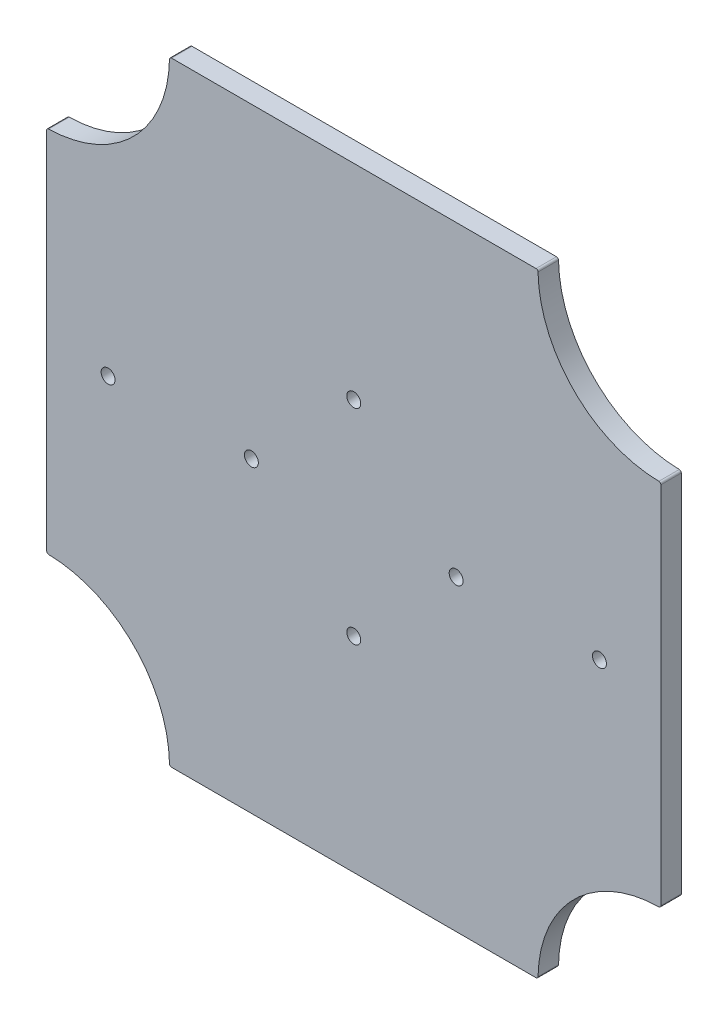
ISO-10303-21;
HEADER;
FILE_DESCRIPTION(('STEP AP214'),'2;1');
FILE_NAME('part.step','',(''),(''),'','','');
FILE_SCHEMA(('AUTOMOTIVE_DESIGN { 1 0 10303 214 1 1 1 1 }'));
ENDSEC;
DATA;
#1=APPLICATION_CONTEXT('core data for automotive mechanical design processes');
#2=APPLICATION_PROTOCOL_DEFINITION('international standard','automotive_design',2000,#1);
#3=PRODUCT_CONTEXT('',#1,'mechanical');
#4=PRODUCT('Part','Part','',(#3));
#5=PRODUCT_RELATED_PRODUCT_CATEGORY('part','',(#4));
#6=PRODUCT_DEFINITION_FORMATION('','',#4);
#7=PRODUCT_DEFINITION_CONTEXT('part definition',#1,'design');
#8=PRODUCT_DEFINITION('design','',#6,#7);
#9=PRODUCT_DEFINITION_SHAPE('','',#8);
#10=(LENGTH_UNIT() NAMED_UNIT(*) SI_UNIT(.MILLI.,.METRE.));
#11=(NAMED_UNIT(*) PLANE_ANGLE_UNIT() SI_UNIT($,.RADIAN.));
#12=(NAMED_UNIT(*) SI_UNIT($,.STERADIAN.) SOLID_ANGLE_UNIT());
#13=UNCERTAINTY_MEASURE_WITH_UNIT(LENGTH_MEASURE(1.E-05),#10,'distance_accuracy_value','');
#14=(GEOMETRIC_REPRESENTATION_CONTEXT(3) GLOBAL_UNCERTAINTY_ASSIGNED_CONTEXT((#13)) GLOBAL_UNIT_ASSIGNED_CONTEXT((#10,
#11,#12)) REPRESENTATION_CONTEXT('',''));
#15=CARTESIAN_POINT('',(0.,0.,0.));
#16=DIRECTION('',(0.,0.,1.));
#17=DIRECTION('',(1.,0.,0.));
#18=AXIS2_PLACEMENT_3D('',#15,#16,#17);
#19=CARTESIAN_POINT('',(0.,0.,0.));
#20=DIRECTION('',(0.,0.,1.));
#21=DIRECTION('',(1.,0.,0.));
#22=AXIS2_PLACEMENT_3D('',#19,#20,#21);
#23=PLANE('',#22);
#24=CARTESIAN_POINT('',(0.,-25.,0.));
#25=DIRECTION('',(0.,0.,-1.));
#26=DIRECTION('',(-1.,0.,0.));
#27=AXIS2_PLACEMENT_3D('',#24,#25,#26);
#28=CIRCLE('',#27,1.69999999999999);
#29=CARTESIAN_POINT('',(-1.69999999999999,-25.,0.));
#30=VERTEX_POINT('',#29);
#31=EDGE_CURVE('E522',#30,#30,#28,.T.);
#32=ORIENTED_EDGE('',*,*,#31,.F.);
#33=EDGE_LOOP('',(#32));
#34=FACE_BOUND('',#33,.T.);
#35=CARTESIAN_POINT('',(-59.9999999999987,0.,0.));
#36=DIRECTION('',(0.,0.,-1.));
#37=DIRECTION('',(-1.,0.,0.));
#38=AXIS2_PLACEMENT_3D('',#35,#36,#37);
#39=CIRCLE('',#38,1.69999999999999);
#40=CARTESIAN_POINT('',(-61.6999999999986,0.,0.));
#41=VERTEX_POINT('',#40);
#42=EDGE_CURVE('E516',#41,#41,#39,.T.);
#43=ORIENTED_EDGE('',*,*,#42,.F.);
#44=EDGE_LOOP('',(#43));
#45=FACE_BOUND('',#44,.T.);
#46=CARTESIAN_POINT('',(75.,75.,0.));
#47=DIRECTION('',(0.,0.,1.));
#48=DIRECTION('',(1.,0.,0.));
#49=AXIS2_PLACEMENT_3D('',#46,#47,#48);
#50=CIRCLE('',#49,30.);
#51=CARTESIAN_POINT('',(74.5081967213114,45.0040314452913,0.));
#52=VERTEX_POINT('',#51);
#53=CARTESIAN_POINT('',(45.0040314452913,74.5081967213115,0.));
#54=VERTEX_POINT('',#53);
#55=EDGE_CURVE('E271',#52,#54,#50,.F.);
#56=ORIENTED_EDGE('',*,*,#55,.F.);
#57=CARTESIAN_POINT('',(74.5,44.5040986360462,0.));
#58=DIRECTION('',(0.,0.,1.));
#59=DIRECTION('',(1.,0.,0.));
#60=AXIS2_PLACEMENT_3D('',#57,#58,#59);
#61=CIRCLE('',#60,0.5);
#62=CARTESIAN_POINT('',(75.,44.5040986360462,0.));
#63=VERTEX_POINT('',#62);
#64=EDGE_CURVE('E216',#52,#63,#61,.F.);
#65=ORIENTED_EDGE('',*,*,#64,.T.);
#66=DIRECTION('',(0.,1.,0.));
#67=VECTOR('',#66,1.);
#68=CARTESIAN_POINT('',(75.,75.,0.));
#69=LINE('',#68,#67);
#70=CARTESIAN_POINT('',(75.,-44.5040986360448,0.));
#71=VERTEX_POINT('',#70);
#72=EDGE_CURVE('E272',#71,#63,#69,.T.);
#73=ORIENTED_EDGE('',*,*,#72,.F.);
#74=CARTESIAN_POINT('',(74.5,-44.5040986360448,0.));
#75=DIRECTION('',(0.,0.,1.));
#76=DIRECTION('',(1.,0.,0.));
#77=AXIS2_PLACEMENT_3D('',#74,#75,#76);
#78=CIRCLE('',#77,0.5);
#79=CARTESIAN_POINT('',(74.5081967213115,-45.00403144529,0.));
#80=VERTEX_POINT('',#79);
#81=EDGE_CURVE('E178',#71,#80,#78,.F.);
#82=ORIENTED_EDGE('',*,*,#81,.T.);
#83=CARTESIAN_POINT('',(75.0000000000028,-74.9999999999986,0.));
#84=DIRECTION('',(0.,0.,1.));
#85=DIRECTION('',(1.,0.,0.));
#86=AXIS2_PLACEMENT_3D('',#83,#84,#85);
#87=CIRCLE('',#86,30.);
#88=CARTESIAN_POINT('',(45.0040314452941,-74.5081967213114,0.));
#89=VERTEX_POINT('',#88);
#90=EDGE_CURVE('E246',#89,#80,#87,.F.);
#91=ORIENTED_EDGE('',*,*,#90,.F.);
#92=CARTESIAN_POINT('',(44.504098636049,-74.5,0.));
#93=DIRECTION('',(0.,0.,1.));
#94=DIRECTION('',(1.,0.,0.));
#95=AXIS2_PLACEMENT_3D('',#92,#93,#94);
#96=CIRCLE('',#95,0.5);
#97=CARTESIAN_POINT('',(44.504098636049,-75.,0.));
#98=VERTEX_POINT('',#97);
#99=EDGE_CURVE('E204',#89,#98,#96,.F.);
#100=ORIENTED_EDGE('',*,*,#99,.T.);
#101=DIRECTION('',(1.,0.,0.));
#102=VECTOR('',#101,1.);
#103=CARTESIAN_POINT('',(-75.,-75.,0.));
#104=LINE('',#103,#102);
#105=CARTESIAN_POINT('',(-44.504098636042,-75.,0.));
#106=VERTEX_POINT('',#105);
#107=EDGE_CURVE('E260',#106,#98,#104,.T.);
#108=ORIENTED_EDGE('',*,*,#107,.F.);
#109=CARTESIAN_POINT('',(-44.504098636042,-74.5,0.));
#110=DIRECTION('',(0.,0.,1.));
#111=DIRECTION('',(1.,0.,0.));
#112=AXIS2_PLACEMENT_3D('',#109,#110,#111);
#113=CIRCLE('',#112,0.5);
#114=CARTESIAN_POINT('',(-45.0040314452871,-74.5081967213115,0.));
#115=VERTEX_POINT('',#114);
#116=EDGE_CURVE('E53',#106,#115,#113,.F.);
#117=ORIENTED_EDGE('',*,*,#116,.T.);
#118=CARTESIAN_POINT('',(-74.9999999999958,-75.0000000000014,0.));
#119=DIRECTION('',(0.,0.,1.));
#120=DIRECTION('',(1.,0.,0.));
#121=AXIS2_PLACEMENT_3D('',#118,#119,#120);
#122=CIRCLE('',#121,30.);
#123=CARTESIAN_POINT('',(-74.5081967213114,-45.0040314452927,0.));
#124=VERTEX_POINT('',#123);
#125=EDGE_CURVE('E302',#124,#115,#122,.F.);
#126=ORIENTED_EDGE('',*,*,#125,.F.);
#127=CARTESIAN_POINT('',(-74.5,-44.5040986360476,0.));
#128=DIRECTION('',(0.,0.,1.));
#129=DIRECTION('',(1.,0.,0.));
#130=AXIS2_PLACEMENT_3D('',#127,#128,#129);
#131=CIRCLE('',#130,0.5);
#132=CARTESIAN_POINT('',(-75.,-44.5040986360476,0.));
#133=VERTEX_POINT('',#132);
#134=EDGE_CURVE('E208',#124,#133,#131,.F.);
#135=ORIENTED_EDGE('',*,*,#134,.T.);
#136=DIRECTION('',(0.,-1.,0.));
#137=VECTOR('',#136,1.);
#138=CARTESIAN_POINT('',(-75.,75.,0.));
#139=LINE('',#138,#137);
#140=CARTESIAN_POINT('',(-75.,44.5040986360433,0.));
#141=VERTEX_POINT('',#140);
#142=EDGE_CURVE('E268',#141,#133,#139,.T.);
#143=ORIENTED_EDGE('',*,*,#142,.F.);
#144=CARTESIAN_POINT('',(-74.5,44.5040986360433,0.));
#145=DIRECTION('',(0.,0.,1.));
#146=DIRECTION('',(1.,0.,0.));
#147=AXIS2_PLACEMENT_3D('',#144,#145,#146);
#148=CIRCLE('',#147,0.5);
#149=CARTESIAN_POINT('',(-74.5081967213115,45.0040314452885,0.));
#150=VERTEX_POINT('',#149);
#151=EDGE_CURVE('E210',#141,#150,#148,.F.);
#152=ORIENTED_EDGE('',*,*,#151,.T.);
#153=CARTESIAN_POINT('',(-74.9999999999986,74.9999999999972,0.));
#154=DIRECTION('',(0.,0.,1.));
#155=DIRECTION('',(1.,0.,0.));
#156=AXIS2_PLACEMENT_3D('',#153,#154,#155);
#157=CIRCLE('',#156,30.);
#158=CARTESIAN_POINT('',(-45.0040314452899,74.5081967213114,0.));
#159=VERTEX_POINT('',#158);
#160=EDGE_CURVE('E293',#159,#150,#157,.F.);
#161=ORIENTED_EDGE('',*,*,#160,.F.);
#162=CARTESIAN_POINT('',(-44.5040986360448,74.5,0.));
#163=DIRECTION('',(0.,0.,1.));
#164=DIRECTION('',(1.,0.,0.));
#165=AXIS2_PLACEMENT_3D('',#162,#163,#164);
#166=CIRCLE('',#165,0.5);
#167=CARTESIAN_POINT('',(-44.5040986360448,75.,0.));
#168=VERTEX_POINT('',#167);
#169=EDGE_CURVE('E212',#159,#168,#166,.F.);
#170=ORIENTED_EDGE('',*,*,#169,.T.);
#171=DIRECTION('',(-1.,0.,0.));
#172=VECTOR('',#171,1.);
#173=CARTESIAN_POINT('',(-75.,75.,0.));
#174=LINE('',#173,#172);
#175=CARTESIAN_POINT('',(44.5040986360462,75.,0.));
#176=VERTEX_POINT('',#175);
#177=EDGE_CURVE('E184',#176,#168,#174,.T.);
#178=ORIENTED_EDGE('',*,*,#177,.F.);
#179=CARTESIAN_POINT('',(44.5040986360462,74.5,0.));
#180=DIRECTION('',(0.,0.,1.));
#181=DIRECTION('',(1.,0.,0.));
#182=AXIS2_PLACEMENT_3D('',#179,#180,#181);
#183=CIRCLE('',#182,0.5);
#184=EDGE_CURVE('E214',#176,#54,#183,.F.);
#185=ORIENTED_EDGE('',*,*,#184,.T.);
#186=EDGE_LOOP('',(#56,#65,#73,#82,#91,#100,#108,#117,#126,#135,#143,#152,#161,#170,#178,#185));
#187=FACE_BOUND('',#186,.T.);
#188=CARTESIAN_POINT('',(60.0000000000028,0.,0.));
#189=DIRECTION('',(0.,0.,-1.));
#190=DIRECTION('',(-1.,0.,0.));
#191=AXIS2_PLACEMENT_3D('',#188,#189,#190);
#192=CIRCLE('',#191,1.69999999999999);
#193=CARTESIAN_POINT('',(58.3000000000028,0.,0.));
#194=VERTEX_POINT('',#193);
#195=EDGE_CURVE('E299',#194,#194,#192,.T.);
#196=ORIENTED_EDGE('',*,*,#195,.F.);
#197=EDGE_LOOP('',(#196));
#198=FACE_BOUND('',#197,.T.);
#199=CARTESIAN_POINT('',(25.,0.,0.));
#200=DIRECTION('',(0.,0.,-1.));
#201=DIRECTION('',(-1.,0.,0.));
#202=AXIS2_PLACEMENT_3D('',#199,#200,#201);
#203=CIRCLE('',#202,1.69999999999999);
#204=CARTESIAN_POINT('',(23.3,0.,0.));
#205=VERTEX_POINT('',#204);
#206=EDGE_CURVE('E504',#205,#205,#203,.T.);
#207=ORIENTED_EDGE('',*,*,#206,.F.);
#208=EDGE_LOOP('',(#207));
#209=FACE_BOUND('',#208,.T.);
#210=CARTESIAN_POINT('',(-25.,0.,0.));
#211=DIRECTION('',(0.,0.,-1.));
#212=DIRECTION('',(-1.,0.,0.));
#213=AXIS2_PLACEMENT_3D('',#210,#211,#212);
#214=CIRCLE('',#213,1.69999999999999);
#215=CARTESIAN_POINT('',(-26.7,0.,0.));
#216=VERTEX_POINT('',#215);
#217=EDGE_CURVE('E510',#216,#216,#214,.T.);
#218=ORIENTED_EDGE('',*,*,#217,.F.);
#219=EDGE_LOOP('',(#218));
#220=FACE_BOUND('',#219,.T.);
#221=CARTESIAN_POINT('',(0.,25.,0.));
#222=DIRECTION('',(0.,0.,-1.));
#223=DIRECTION('',(-1.,0.,0.));
#224=AXIS2_PLACEMENT_3D('',#221,#222,#223);
#225=CIRCLE('',#224,1.69999999999999);
#226=CARTESIAN_POINT('',(-1.69999999999999,25.,0.));
#227=VERTEX_POINT('',#226);
#228=EDGE_CURVE('E528',#227,#227,#225,.T.);
#229=ORIENTED_EDGE('',*,*,#228,.F.);
#230=EDGE_LOOP('',(#229));
#231=FACE_BOUND('',#230,.T.);
#232=ADVANCED_FACE('F38',(#34,#45,#187,#198,#209,#220,#231),#23,.F.);
#233=CARTESIAN_POINT('',(-75.,75.,5.));
#234=DIRECTION('',(1.,0.,0.));
#235=DIRECTION('',(0.,1.,0.));
#236=AXIS2_PLACEMENT_3D('',#233,#234,#235);
#237=PLANE('',#236);
#238=DIRECTION('',(0.,-1.,0.));
#239=VECTOR('',#238,1.);
#240=CARTESIAN_POINT('',(-75.,75.,5.));
#241=LINE('',#240,#239);
#242=CARTESIAN_POINT('',(-75.,44.5040986360433,5.));
#243=VERTEX_POINT('',#242);
#244=CARTESIAN_POINT('',(-75.,-44.5040986360476,5.));
#245=VERTEX_POINT('',#244);
#246=EDGE_CURVE('E262',#243,#245,#241,.T.);
#247=ORIENTED_EDGE('',*,*,#246,.F.);
#248=DIRECTION('',(0.,0.,1.));
#249=VECTOR('',#248,1.);
#250=CARTESIAN_POINT('',(-75.,44.5040986360433,5.));
#251=LINE('',#250,#249);
#252=EDGE_CURVE('E231',#243,#141,#251,.F.);
#253=ORIENTED_EDGE('',*,*,#252,.T.);
#254=ORIENTED_EDGE('',*,*,#142,.T.);
#255=DIRECTION('',(0.,0.,1.));
#256=VECTOR('',#255,1.);
#257=CARTESIAN_POINT('',(-75.,-44.5040986360476,5.));
#258=LINE('',#257,#256);
#259=EDGE_CURVE('E228',#133,#245,#258,.T.);
#260=ORIENTED_EDGE('',*,*,#259,.T.);
#261=EDGE_LOOP('',(#247,#253,#254,#260));
#262=FACE_BOUND('',#261,.T.);
#263=ADVANCED_FACE('F328',(#262),#237,.F.);
#264=CARTESIAN_POINT('',(-75.,-75.,5.));
#265=DIRECTION('',(0.,1.,0.));
#266=DIRECTION('',(0.,0.,1.));
#267=AXIS2_PLACEMENT_3D('',#264,#265,#266);
#268=PLANE('',#267);
#269=DIRECTION('',(1.,0.,0.));
#270=VECTOR('',#269,1.);
#271=CARTESIAN_POINT('',(-75.,-75.,5.));
#272=LINE('',#271,#270);
#273=CARTESIAN_POINT('',(-44.504098636042,-75.,5.));
#274=VERTEX_POINT('',#273);
#275=CARTESIAN_POINT('',(44.504098636049,-75.,5.));
#276=VERTEX_POINT('',#275);
#277=EDGE_CURVE('E174',#274,#276,#272,.T.);
#278=ORIENTED_EDGE('',*,*,#277,.F.);
#279=DIRECTION('',(0.,0.,1.));
#280=VECTOR('',#279,1.);
#281=CARTESIAN_POINT('',(-44.504098636042,-75.,5.));
#282=LINE('',#281,#280);
#283=EDGE_CURVE('E240',#274,#106,#282,.F.);
#284=ORIENTED_EDGE('',*,*,#283,.T.);
#285=ORIENTED_EDGE('',*,*,#107,.T.);
#286=DIRECTION('',(0.,0.,1.));
#287=VECTOR('',#286,1.);
#288=CARTESIAN_POINT('',(44.504098636049,-75.,5.));
#289=LINE('',#288,#287);
#290=EDGE_CURVE('E237',#98,#276,#289,.T.);
#291=ORIENTED_EDGE('',*,*,#290,.T.);
#292=EDGE_LOOP('',(#278,#284,#285,#291));
#293=FACE_BOUND('',#292,.T.);
#294=ADVANCED_FACE('F258',(#293),#268,.F.);
#295=CARTESIAN_POINT('',(75.,75.,5.));
#296=DIRECTION('',(-1.,0.,0.));
#297=DIRECTION('',(0.,-1.,0.));
#298=AXIS2_PLACEMENT_3D('',#295,#296,#297);
#299=PLANE('',#298);
#300=ORIENTED_EDGE('',*,*,#72,.T.);
#301=DIRECTION('',(0.,0.,1.));
#302=VECTOR('',#301,1.);
#303=CARTESIAN_POINT('',(75.,44.5040986360462,5.));
#304=LINE('',#303,#302);
#305=CARTESIAN_POINT('',(75.,44.5040986360462,5.));
#306=VERTEX_POINT('',#305);
#307=EDGE_CURVE('E172',#63,#306,#304,.T.);
#308=ORIENTED_EDGE('',*,*,#307,.T.);
#309=DIRECTION('',(0.,1.,0.));
#310=VECTOR('',#309,1.);
#311=CARTESIAN_POINT('',(75.,75.,5.));
#312=LINE('',#311,#310);
#313=CARTESIAN_POINT('',(75.,-44.5040986360448,5.));
#314=VERTEX_POINT('',#313);
#315=EDGE_CURVE('E156',#314,#306,#312,.T.);
#316=ORIENTED_EDGE('',*,*,#315,.F.);
#317=DIRECTION('',(0.,0.,1.));
#318=VECTOR('',#317,1.);
#319=CARTESIAN_POINT('',(75.,-44.5040986360448,5.));
#320=LINE('',#319,#318);
#321=EDGE_CURVE('E169',#314,#71,#320,.F.);
#322=ORIENTED_EDGE('',*,*,#321,.T.);
#323=EDGE_LOOP('',(#300,#308,#316,#322));
#324=FACE_BOUND('',#323,.T.);
#325=ADVANCED_FACE('F168',(#324),#299,.F.);
#326=CARTESIAN_POINT('',(-75.,75.,5.));
#327=DIRECTION('',(0.,-1.,0.));
#328=DIRECTION('',(0.,0.,-1.));
#329=AXIS2_PLACEMENT_3D('',#326,#327,#328);
#330=PLANE('',#329);
#331=DIRECTION('',(-1.,0.,0.));
#332=VECTOR('',#331,1.);
#333=CARTESIAN_POINT('',(-75.,75.,5.));
#334=LINE('',#333,#332);
#335=CARTESIAN_POINT('',(44.5040986360462,75.,5.));
#336=VERTEX_POINT('',#335);
#337=CARTESIAN_POINT('',(-44.5040986360448,75.,5.));
#338=VERTEX_POINT('',#337);
#339=EDGE_CURVE('E173',#336,#338,#334,.T.);
#340=ORIENTED_EDGE('',*,*,#339,.F.);
#341=DIRECTION('',(0.,0.,1.));
#342=VECTOR('',#341,1.);
#343=CARTESIAN_POINT('',(44.5040986360462,75.,5.));
#344=LINE('',#343,#342);
#345=EDGE_CURVE('E221',#336,#176,#344,.F.);
#346=ORIENTED_EDGE('',*,*,#345,.T.);
#347=ORIENTED_EDGE('',*,*,#177,.T.);
#348=DIRECTION('',(0.,0.,1.));
#349=VECTOR('',#348,1.);
#350=CARTESIAN_POINT('',(-44.5040986360448,75.,5.));
#351=LINE('',#350,#349);
#352=EDGE_CURVE('E218',#168,#338,#351,.T.);
#353=ORIENTED_EDGE('',*,*,#352,.T.);
#354=EDGE_LOOP('',(#340,#346,#347,#353));
#355=FACE_BOUND('',#354,.T.);
#356=ADVANCED_FACE('F278',(#355),#330,.F.);
#357=CARTESIAN_POINT('',(0.,0.,5.));
#358=DIRECTION('',(0.,0.,1.));
#359=DIRECTION('',(1.,0.,0.));
#360=AXIS2_PLACEMENT_3D('',#357,#358,#359);
#361=PLANE('',#360);
#362=CARTESIAN_POINT('',(0.,25.,5.));
#363=DIRECTION('',(0.,0.,1.));
#364=DIRECTION('',(1.,0.,0.));
#365=AXIS2_PLACEMENT_3D('',#362,#363,#364);
#366=CIRCLE('',#365,1.69999999999999);
#367=CARTESIAN_POINT('',(1.69999999999999,25.,5.));
#368=VERTEX_POINT('',#367);
#369=EDGE_CURVE('E525',#368,#368,#366,.T.);
#370=ORIENTED_EDGE('',*,*,#369,.F.);
#371=EDGE_LOOP('',(#370));
#372=FACE_BOUND('',#371,.T.);
#373=CARTESIAN_POINT('',(0.,-25.,5.));
#374=DIRECTION('',(0.,0.,1.));
#375=DIRECTION('',(1.,0.,0.));
#376=AXIS2_PLACEMENT_3D('',#373,#374,#375);
#377=CIRCLE('',#376,1.69999999999999);
#378=CARTESIAN_POINT('',(1.69999999999999,-25.,5.));
#379=VERTEX_POINT('',#378);
#380=EDGE_CURVE('E519',#379,#379,#377,.T.);
#381=ORIENTED_EDGE('',*,*,#380,.F.);
#382=EDGE_LOOP('',(#381));
#383=FACE_BOUND('',#382,.T.);
#384=CARTESIAN_POINT('',(-59.9999999999987,0.,5.));
#385=DIRECTION('',(0.,0.,1.));
#386=DIRECTION('',(1.,0.,0.));
#387=AXIS2_PLACEMENT_3D('',#384,#385,#386);
#388=CIRCLE('',#387,1.69999999999999);
#389=CARTESIAN_POINT('',(-58.2999999999987,0.,5.));
#390=VERTEX_POINT('',#389);
#391=EDGE_CURVE('E513',#390,#390,#388,.T.);
#392=ORIENTED_EDGE('',*,*,#391,.F.);
#393=EDGE_LOOP('',(#392));
#394=FACE_BOUND('',#393,.T.);
#395=CARTESIAN_POINT('',(-25.,0.,5.));
#396=DIRECTION('',(0.,0.,1.));
#397=DIRECTION('',(1.,0.,0.));
#398=AXIS2_PLACEMENT_3D('',#395,#396,#397);
#399=CIRCLE('',#398,1.69999999999999);
#400=CARTESIAN_POINT('',(-23.3,0.,5.));
#401=VERTEX_POINT('',#400);
#402=EDGE_CURVE('E507',#401,#401,#399,.T.);
#403=ORIENTED_EDGE('',*,*,#402,.F.);
#404=EDGE_LOOP('',(#403));
#405=FACE_BOUND('',#404,.T.);
#406=CARTESIAN_POINT('',(25.,0.,5.));
#407=DIRECTION('',(0.,0.,1.));
#408=DIRECTION('',(1.,0.,0.));
#409=AXIS2_PLACEMENT_3D('',#406,#407,#408);
#410=CIRCLE('',#409,1.69999999999999);
#411=CARTESIAN_POINT('',(26.7,0.,5.));
#412=VERTEX_POINT('',#411);
#413=EDGE_CURVE('E501',#412,#412,#410,.T.);
#414=ORIENTED_EDGE('',*,*,#413,.F.);
#415=EDGE_LOOP('',(#414));
#416=FACE_BOUND('',#415,.T.);
#417=CARTESIAN_POINT('',(60.0000000000028,0.,5.));
#418=DIRECTION('',(0.,0.,1.));
#419=DIRECTION('',(1.,0.,0.));
#420=AXIS2_PLACEMENT_3D('',#417,#418,#419);
#421=CIRCLE('',#420,1.69999999999999);
#422=CARTESIAN_POINT('',(61.7000000000028,0.,5.));
#423=VERTEX_POINT('',#422);
#424=EDGE_CURVE('E294',#423,#423,#421,.T.);
#425=ORIENTED_EDGE('',*,*,#424,.F.);
#426=EDGE_LOOP('',(#425));
#427=FACE_BOUND('',#426,.T.);
#428=ORIENTED_EDGE('',*,*,#315,.T.);
#429=CARTESIAN_POINT('',(74.5,44.5040986360462,5.));
#430=DIRECTION('',(0.,0.,1.));
#431=DIRECTION('',(1.,0.,0.));
#432=AXIS2_PLACEMENT_3D('',#429,#430,#431);
#433=CIRCLE('',#432,0.5);
#434=CARTESIAN_POINT('',(74.5081967213114,45.0040314452913,5.));
#435=VERTEX_POINT('',#434);
#436=EDGE_CURVE('E197',#306,#435,#433,.T.);
#437=ORIENTED_EDGE('',*,*,#436,.T.);
#438=CARTESIAN_POINT('',(75.,75.,5.));
#439=DIRECTION('',(0.,0.,1.));
#440=DIRECTION('',(1.,0.,0.));
#441=AXIS2_PLACEMENT_3D('',#438,#439,#440);
#442=CIRCLE('',#441,30.);
#443=CARTESIAN_POINT('',(45.0040314452913,74.5081967213115,5.));
#444=VERTEX_POINT('',#443);
#445=EDGE_CURVE('E252',#444,#435,#442,.T.);
#446=ORIENTED_EDGE('',*,*,#445,.F.);
#447=CARTESIAN_POINT('',(44.5040986360462,74.5,5.));
#448=DIRECTION('',(0.,0.,1.));
#449=DIRECTION('',(1.,0.,0.));
#450=AXIS2_PLACEMENT_3D('',#447,#448,#449);
#451=CIRCLE('',#450,0.5);
#452=EDGE_CURVE('E195',#444,#336,#451,.T.);
#453=ORIENTED_EDGE('',*,*,#452,.T.);
#454=ORIENTED_EDGE('',*,*,#339,.T.);
#455=CARTESIAN_POINT('',(-44.5040986360448,74.5,5.));
#456=DIRECTION('',(0.,0.,1.));
#457=DIRECTION('',(1.,0.,0.));
#458=AXIS2_PLACEMENT_3D('',#455,#456,#457);
#459=CIRCLE('',#458,0.5);
#460=CARTESIAN_POINT('',(-45.0040314452899,74.5081967213114,5.));
#461=VERTEX_POINT('',#460);
#462=EDGE_CURVE('E193',#338,#461,#459,.T.);
#463=ORIENTED_EDGE('',*,*,#462,.T.);
#464=CARTESIAN_POINT('',(-74.9999999999986,74.9999999999972,5.));
#465=DIRECTION('',(0.,0.,1.));
#466=DIRECTION('',(1.,0.,0.));
#467=AXIS2_PLACEMENT_3D('',#464,#465,#466);
#468=CIRCLE('',#467,30.);
#469=CARTESIAN_POINT('',(-74.5081967213115,45.0040314452885,5.));
#470=VERTEX_POINT('',#469);
#471=EDGE_CURVE('E287',#470,#461,#468,.T.);
#472=ORIENTED_EDGE('',*,*,#471,.F.);
#473=CARTESIAN_POINT('',(-74.5,44.5040986360433,5.));
#474=DIRECTION('',(0.,0.,1.));
#475=DIRECTION('',(1.,0.,0.));
#476=AXIS2_PLACEMENT_3D('',#473,#474,#475);
#477=CIRCLE('',#476,0.5);
#478=EDGE_CURVE('E191',#470,#243,#477,.T.);
#479=ORIENTED_EDGE('',*,*,#478,.T.);
#480=ORIENTED_EDGE('',*,*,#246,.T.);
#481=CARTESIAN_POINT('',(-74.5,-44.5040986360476,5.));
#482=DIRECTION('',(0.,0.,1.));
#483=DIRECTION('',(1.,0.,0.));
#484=AXIS2_PLACEMENT_3D('',#481,#482,#483);
#485=CIRCLE('',#484,0.5);
#486=CARTESIAN_POINT('',(-74.5081967213114,-45.0040314452927,5.));
#487=VERTEX_POINT('',#486);
#488=EDGE_CURVE('E189',#245,#487,#485,.T.);
#489=ORIENTED_EDGE('',*,*,#488,.T.);
#490=CARTESIAN_POINT('',(-74.9999999999958,-75.0000000000014,5.));
#491=DIRECTION('',(0.,0.,1.));
#492=DIRECTION('',(1.,0.,0.));
#493=AXIS2_PLACEMENT_3D('',#490,#491,#492);
#494=CIRCLE('',#493,30.);
#495=CARTESIAN_POINT('',(-45.0040314452871,-74.5081967213115,5.));
#496=VERTEX_POINT('',#495);
#497=EDGE_CURVE('E296',#496,#487,#494,.T.);
#498=ORIENTED_EDGE('',*,*,#497,.F.);
#499=CARTESIAN_POINT('',(-44.504098636042,-74.5,5.));
#500=DIRECTION('',(0.,0.,1.));
#501=DIRECTION('',(1.,0.,0.));
#502=AXIS2_PLACEMENT_3D('',#499,#500,#501);
#503=CIRCLE('',#502,0.5);
#504=EDGE_CURVE('E162',#496,#274,#503,.T.);
#505=ORIENTED_EDGE('',*,*,#504,.T.);
#506=ORIENTED_EDGE('',*,*,#277,.T.);
#507=CARTESIAN_POINT('',(44.504098636049,-74.5,5.));
#508=DIRECTION('',(0.,0.,1.));
#509=DIRECTION('',(1.,0.,0.));
#510=AXIS2_PLACEMENT_3D('',#507,#508,#509);
#511=CIRCLE('',#510,0.5);
#512=CARTESIAN_POINT('',(45.0040314452941,-74.5081967213114,5.));
#513=VERTEX_POINT('',#512);
#514=EDGE_CURVE('E163',#276,#513,#511,.T.);
#515=ORIENTED_EDGE('',*,*,#514,.T.);
#516=CARTESIAN_POINT('',(75.0000000000028,-74.9999999999986,5.));
#517=DIRECTION('',(0.,0.,1.));
#518=DIRECTION('',(1.,0.,0.));
#519=AXIS2_PLACEMENT_3D('',#516,#517,#518);
#520=CIRCLE('',#519,30.);
#521=CARTESIAN_POINT('',(74.5081967213115,-45.00403144529,5.));
#522=VERTEX_POINT('',#521);
#523=EDGE_CURVE('E158',#522,#513,#520,.T.);
#524=ORIENTED_EDGE('',*,*,#523,.F.);
#525=CARTESIAN_POINT('',(74.5,-44.5040986360448,5.));
#526=DIRECTION('',(0.,0.,1.));
#527=DIRECTION('',(1.,0.,0.));
#528=AXIS2_PLACEMENT_3D('',#525,#526,#527);
#529=CIRCLE('',#528,0.5);
#530=EDGE_CURVE('E153',#522,#314,#529,.T.);
#531=ORIENTED_EDGE('',*,*,#530,.T.);
#532=EDGE_LOOP('',(#428,#437,#446,#453,#454,#463,#472,#479,#480,#489,#498,#505,#506,#515,#524,#531));
#533=FACE_BOUND('',#532,.T.);
#534=ADVANCED_FACE('F155',(#372,#383,#394,#405,#416,#427,#533),#361,.T.);
#535=CARTESIAN_POINT('',(75.,75.,-42.4264068711929));
#536=DIRECTION('',(0.,0.,1.));
#537=DIRECTION('',(1.,0.,0.));
#538=AXIS2_PLACEMENT_3D('',#535,#536,#537);
#539=CYLINDRICAL_SURFACE('',#538,30.);
#540=ORIENTED_EDGE('',*,*,#445,.T.);
#541=DIRECTION('',(0.,0.,1.));
#542=VECTOR('',#541,1.);
#543=CARTESIAN_POINT('',(74.5081967213114,45.0040314452913,-42.4264068711929));
#544=LINE('',#543,#542);
#545=EDGE_CURVE('E202',#435,#52,#544,.F.);
#546=ORIENTED_EDGE('',*,*,#545,.T.);
#547=ORIENTED_EDGE('',*,*,#55,.T.);
#548=DIRECTION('',(0.,0.,1.));
#549=VECTOR('',#548,1.);
#550=CARTESIAN_POINT('',(45.0040314452913,74.5081967213115,-42.4264068711929));
#551=LINE('',#550,#549);
#552=EDGE_CURVE('E199',#54,#444,#551,.T.);
#553=ORIENTED_EDGE('',*,*,#552,.T.);
#554=EDGE_LOOP('',(#540,#546,#547,#553));
#555=FACE_BOUND('',#554,.T.);
#556=ADVANCED_FACE('F310',(#555),#539,.F.);
#557=CARTESIAN_POINT('',(75.0000000000028,-74.9999999999986,-42.4264068711929));
#558=DIRECTION('',(0.,0.,1.));
#559=DIRECTION('',(1.,0.,0.));
#560=AXIS2_PLACEMENT_3D('',#557,#558,#559);
#561=CYLINDRICAL_SURFACE('',#560,30.);
#562=ORIENTED_EDGE('',*,*,#90,.T.);
#563=DIRECTION('',(0.,0.,1.));
#564=VECTOR('',#563,1.);
#565=CARTESIAN_POINT('',(74.5081967213115,-45.00403144529,-42.4264068711929));
#566=LINE('',#565,#564);
#567=EDGE_CURVE('E11',#80,#522,#566,.T.);
#568=ORIENTED_EDGE('',*,*,#567,.T.);
#569=ORIENTED_EDGE('',*,*,#523,.T.);
#570=DIRECTION('',(0.,0.,1.));
#571=VECTOR('',#570,1.);
#572=CARTESIAN_POINT('',(45.0040314452941,-74.5081967213114,-42.4264068711929));
#573=LINE('',#572,#571);
#574=EDGE_CURVE('E46',#513,#89,#573,.F.);
#575=ORIENTED_EDGE('',*,*,#574,.T.);
#576=EDGE_LOOP('',(#562,#568,#569,#575));
#577=FACE_BOUND('',#576,.T.);
#578=ADVANCED_FACE('F245',(#577),#561,.F.);
#579=CARTESIAN_POINT('',(-74.9999999999958,-75.0000000000014,-42.4264068711929));
#580=DIRECTION('',(0.,0.,1.));
#581=DIRECTION('',(1.,0.,0.));
#582=AXIS2_PLACEMENT_3D('',#579,#580,#581);
#583=CYLINDRICAL_SURFACE('',#582,30.);
#584=ORIENTED_EDGE('',*,*,#497,.T.);
#585=DIRECTION('',(0.,0.,1.));
#586=VECTOR('',#585,1.);
#587=CARTESIAN_POINT('',(-74.5081967213114,-45.0040314452927,-42.4264068711929));
#588=LINE('',#587,#586);
#589=EDGE_CURVE('E60',#487,#124,#588,.F.);
#590=ORIENTED_EDGE('',*,*,#589,.T.);
#591=ORIENTED_EDGE('',*,*,#125,.T.);
#592=DIRECTION('',(0.,0.,1.));
#593=VECTOR('',#592,1.);
#594=CARTESIAN_POINT('',(-45.0040314452871,-74.5081967213115,-42.4264068711929));
#595=LINE('',#594,#593);
#596=EDGE_CURVE('E233',#115,#496,#595,.T.);
#597=ORIENTED_EDGE('',*,*,#596,.T.);
#598=EDGE_LOOP('',(#584,#590,#591,#597));
#599=FACE_BOUND('',#598,.T.);
#600=ADVANCED_FACE('F375',(#599),#583,.F.);
#601=CARTESIAN_POINT('',(-74.9999999999986,74.9999999999972,-42.4264068711929));
#602=DIRECTION('',(0.,0.,1.));
#603=DIRECTION('',(1.,0.,0.));
#604=AXIS2_PLACEMENT_3D('',#601,#602,#603);
#605=CYLINDRICAL_SURFACE('',#604,30.);
#606=ORIENTED_EDGE('',*,*,#471,.T.);
#607=DIRECTION('',(0.,0.,1.));
#608=VECTOR('',#607,1.);
#609=CARTESIAN_POINT('',(-45.0040314452899,74.5081967213114,-42.4264068711929));
#610=LINE('',#609,#608);
#611=EDGE_CURVE('E226',#461,#159,#610,.F.);
#612=ORIENTED_EDGE('',*,*,#611,.T.);
#613=ORIENTED_EDGE('',*,*,#160,.T.);
#614=DIRECTION('',(0.,0.,1.));
#615=VECTOR('',#614,1.);
#616=CARTESIAN_POINT('',(-74.5081967213115,45.0040314452885,-42.4264068711929));
#617=LINE('',#616,#615);
#618=EDGE_CURVE('E223',#150,#470,#617,.T.);
#619=ORIENTED_EDGE('',*,*,#618,.T.);
#620=EDGE_LOOP('',(#606,#612,#613,#619));
#621=FACE_BOUND('',#620,.T.);
#622=ADVANCED_FACE('F289',(#621),#605,.F.);
#623=CARTESIAN_POINT('',(60.0000000000028,0.,0.));
#624=DIRECTION('',(0.,0.,-1.));
#625=DIRECTION('',(-1.,0.,0.));
#626=AXIS2_PLACEMENT_3D('',#623,#624,#625);
#627=CYLINDRICAL_SURFACE('',#626,1.69999999999999);
#628=ORIENTED_EDGE('',*,*,#195,.T.);
#629=EDGE_LOOP('',(#628));
#630=FACE_BOUND('',#629,.T.);
#631=ORIENTED_EDGE('',*,*,#424,.T.);
#632=EDGE_LOOP('',(#631));
#633=FACE_BOUND('',#632,.T.);
#634=ADVANCED_FACE('F388',(#630,#633),#627,.F.);
#635=CARTESIAN_POINT('',(25.,0.,0.));
#636=DIRECTION('',(0.,0.,-1.));
#637=DIRECTION('',(-1.,0.,0.));
#638=AXIS2_PLACEMENT_3D('',#635,#636,#637);
#639=CYLINDRICAL_SURFACE('',#638,1.69999999999999);
#640=ORIENTED_EDGE('',*,*,#206,.T.);
#641=EDGE_LOOP('',(#640));
#642=FACE_BOUND('',#641,.T.);
#643=ORIENTED_EDGE('',*,*,#413,.T.);
#644=EDGE_LOOP('',(#643));
#645=FACE_BOUND('',#644,.T.);
#646=ADVANCED_FACE('F396',(#642,#645),#639,.F.);
#647=CARTESIAN_POINT('',(-25.,0.,0.));
#648=DIRECTION('',(0.,0.,-1.));
#649=DIRECTION('',(-1.,0.,0.));
#650=AXIS2_PLACEMENT_3D('',#647,#648,#649);
#651=CYLINDRICAL_SURFACE('',#650,1.69999999999999);
#652=ORIENTED_EDGE('',*,*,#217,.T.);
#653=EDGE_LOOP('',(#652));
#654=FACE_BOUND('',#653,.T.);
#655=ORIENTED_EDGE('',*,*,#402,.T.);
#656=EDGE_LOOP('',(#655));
#657=FACE_BOUND('',#656,.T.);
#658=ADVANCED_FACE('F404',(#654,#657),#651,.F.);
#659=CARTESIAN_POINT('',(-59.9999999999987,0.,0.));
#660=DIRECTION('',(0.,0.,-1.));
#661=DIRECTION('',(-1.,0.,0.));
#662=AXIS2_PLACEMENT_3D('',#659,#660,#661);
#663=CYLINDRICAL_SURFACE('',#662,1.69999999999999);
#664=ORIENTED_EDGE('',*,*,#42,.T.);
#665=EDGE_LOOP('',(#664));
#666=FACE_BOUND('',#665,.T.);
#667=ORIENTED_EDGE('',*,*,#391,.T.);
#668=EDGE_LOOP('',(#667));
#669=FACE_BOUND('',#668,.T.);
#670=ADVANCED_FACE('F412',(#666,#669),#663,.F.);
#671=CARTESIAN_POINT('',(0.,-25.,0.));
#672=DIRECTION('',(0.,0.,-1.));
#673=DIRECTION('',(-1.,0.,0.));
#674=AXIS2_PLACEMENT_3D('',#671,#672,#673);
#675=CYLINDRICAL_SURFACE('',#674,1.69999999999999);
#676=ORIENTED_EDGE('',*,*,#31,.T.);
#677=EDGE_LOOP('',(#676));
#678=FACE_BOUND('',#677,.T.);
#679=ORIENTED_EDGE('',*,*,#380,.T.);
#680=EDGE_LOOP('',(#679));
#681=FACE_BOUND('',#680,.T.);
#682=ADVANCED_FACE('F420',(#678,#681),#675,.F.);
#683=CARTESIAN_POINT('',(0.,25.,0.));
#684=DIRECTION('',(0.,0.,-1.));
#685=DIRECTION('',(-1.,0.,0.));
#686=AXIS2_PLACEMENT_3D('',#683,#684,#685);
#687=CYLINDRICAL_SURFACE('',#686,1.69999999999999);
#688=ORIENTED_EDGE('',*,*,#228,.T.);
#689=EDGE_LOOP('',(#688));
#690=FACE_BOUND('',#689,.T.);
#691=ORIENTED_EDGE('',*,*,#369,.T.);
#692=EDGE_LOOP('',(#691));
#693=FACE_BOUND('',#692,.T.);
#694=ADVANCED_FACE('F325',(#690,#693),#687,.F.);
#695=CARTESIAN_POINT('',(74.5,44.5040986360462,-42.4264068711929));
#696=DIRECTION('',(0.,0.,1.));
#697=DIRECTION('',(1.,0.,0.));
#698=AXIS2_PLACEMENT_3D('',#695,#696,#697);
#699=CYLINDRICAL_SURFACE('',#698,0.5);
#700=ORIENTED_EDGE('',*,*,#64,.F.);
#701=ORIENTED_EDGE('',*,*,#545,.F.);
#702=ORIENTED_EDGE('',*,*,#436,.F.);
#703=ORIENTED_EDGE('',*,*,#307,.F.);
#704=EDGE_LOOP('',(#700,#701,#702,#703));
#705=FACE_BOUND('',#704,.T.);
#706=ADVANCED_FACE('F314',(#705),#699,.T.);
#707=CARTESIAN_POINT('',(44.5040986360462,74.5,-42.4264068711929));
#708=DIRECTION('',(0.,0.,1.));
#709=DIRECTION('',(1.,0.,0.));
#710=AXIS2_PLACEMENT_3D('',#707,#708,#709);
#711=CYLINDRICAL_SURFACE('',#710,0.5);
#712=ORIENTED_EDGE('',*,*,#184,.F.);
#713=ORIENTED_EDGE('',*,*,#345,.F.);
#714=ORIENTED_EDGE('',*,*,#452,.F.);
#715=ORIENTED_EDGE('',*,*,#552,.F.);
#716=EDGE_LOOP('',(#712,#713,#714,#715));
#717=FACE_BOUND('',#716,.T.);
#718=ADVANCED_FACE('F316',(#717),#711,.T.);
#719=CARTESIAN_POINT('',(-44.5040986360448,74.5,-42.4264068711929));
#720=DIRECTION('',(0.,0.,1.));
#721=DIRECTION('',(1.,0.,0.));
#722=AXIS2_PLACEMENT_3D('',#719,#720,#721);
#723=CYLINDRICAL_SURFACE('',#722,0.5);
#724=ORIENTED_EDGE('',*,*,#169,.F.);
#725=ORIENTED_EDGE('',*,*,#611,.F.);
#726=ORIENTED_EDGE('',*,*,#462,.F.);
#727=ORIENTED_EDGE('',*,*,#352,.F.);
#728=EDGE_LOOP('',(#724,#725,#726,#727));
#729=FACE_BOUND('',#728,.T.);
#730=ADVANCED_FACE('F283',(#729),#723,.T.);
#731=CARTESIAN_POINT('',(-74.5,44.5040986360433,-42.4264068711929));
#732=DIRECTION('',(0.,0.,1.));
#733=DIRECTION('',(1.,0.,0.));
#734=AXIS2_PLACEMENT_3D('',#731,#732,#733);
#735=CYLINDRICAL_SURFACE('',#734,0.5);
#736=ORIENTED_EDGE('',*,*,#151,.F.);
#737=ORIENTED_EDGE('',*,*,#252,.F.);
#738=ORIENTED_EDGE('',*,*,#478,.F.);
#739=ORIENTED_EDGE('',*,*,#618,.F.);
#740=EDGE_LOOP('',(#736,#737,#738,#739));
#741=FACE_BOUND('',#740,.T.);
#742=ADVANCED_FACE('F323',(#741),#735,.T.);
#743=CARTESIAN_POINT('',(-74.5,-44.5040986360476,-42.4264068711929));
#744=DIRECTION('',(0.,0.,1.));
#745=DIRECTION('',(1.,0.,0.));
#746=AXIS2_PLACEMENT_3D('',#743,#744,#745);
#747=CYLINDRICAL_SURFACE('',#746,0.5);
#748=ORIENTED_EDGE('',*,*,#134,.F.);
#749=ORIENTED_EDGE('',*,*,#589,.F.);
#750=ORIENTED_EDGE('',*,*,#488,.F.);
#751=ORIENTED_EDGE('',*,*,#259,.F.);
#752=EDGE_LOOP('',(#748,#749,#750,#751));
#753=FACE_BOUND('',#752,.T.);
#754=ADVANCED_FACE('F458',(#753),#747,.T.);
#755=CARTESIAN_POINT('',(-44.504098636042,-74.5,-42.4264068711929));
#756=DIRECTION('',(0.,0.,1.));
#757=DIRECTION('',(1.,0.,0.));
#758=AXIS2_PLACEMENT_3D('',#755,#756,#757);
#759=CYLINDRICAL_SURFACE('',#758,0.5);
#760=ORIENTED_EDGE('',*,*,#116,.F.);
#761=ORIENTED_EDGE('',*,*,#283,.F.);
#762=ORIENTED_EDGE('',*,*,#504,.F.);
#763=ORIENTED_EDGE('',*,*,#596,.F.);
#764=EDGE_LOOP('',(#760,#761,#762,#763));
#765=FACE_BOUND('',#764,.T.);
#766=ADVANCED_FACE('F468',(#765),#759,.T.);
#767=CARTESIAN_POINT('',(74.5,-44.5040986360448,-42.4264068711929));
#768=DIRECTION('',(0.,0.,1.));
#769=DIRECTION('',(1.,0.,0.));
#770=AXIS2_PLACEMENT_3D('',#767,#768,#769);
#771=CYLINDRICAL_SURFACE('',#770,0.5);
#772=ORIENTED_EDGE('',*,*,#81,.F.);
#773=ORIENTED_EDGE('',*,*,#321,.F.);
#774=ORIENTED_EDGE('',*,*,#530,.F.);
#775=ORIENTED_EDGE('',*,*,#567,.F.);
#776=EDGE_LOOP('',(#772,#773,#774,#775));
#777=FACE_BOUND('',#776,.T.);
#778=ADVANCED_FACE('F177',(#777),#771,.T.);
#779=CARTESIAN_POINT('',(44.504098636049,-74.5,-42.4264068711929));
#780=DIRECTION('',(0.,0.,1.));
#781=DIRECTION('',(1.,0.,0.));
#782=AXIS2_PLACEMENT_3D('',#779,#780,#781);
#783=CYLINDRICAL_SURFACE('',#782,0.5);
#784=ORIENTED_EDGE('',*,*,#99,.F.);
#785=ORIENTED_EDGE('',*,*,#574,.F.);
#786=ORIENTED_EDGE('',*,*,#514,.F.);
#787=ORIENTED_EDGE('',*,*,#290,.F.);
#788=EDGE_LOOP('',(#784,#785,#786,#787));
#789=FACE_BOUND('',#788,.T.);
#790=ADVANCED_FACE('F40',(#789),#783,.T.);
#791=CLOSED_SHELL('',(#232,#263,#294,#325,#356,#534,#556,#578,#600,#622,#634,#646,#658,#670,
#682,#694,#706,#718,#730,#742,#754,#766,#778,#790));
#792=MANIFOLD_SOLID_BREP('B2',#791);
#793=ADVANCED_BREP_SHAPE_REPRESENTATION('',(#18,#792),#14);
#794=SHAPE_DEFINITION_REPRESENTATION(#9,#793);
ENDSEC;
END-ISO-10303-21;
